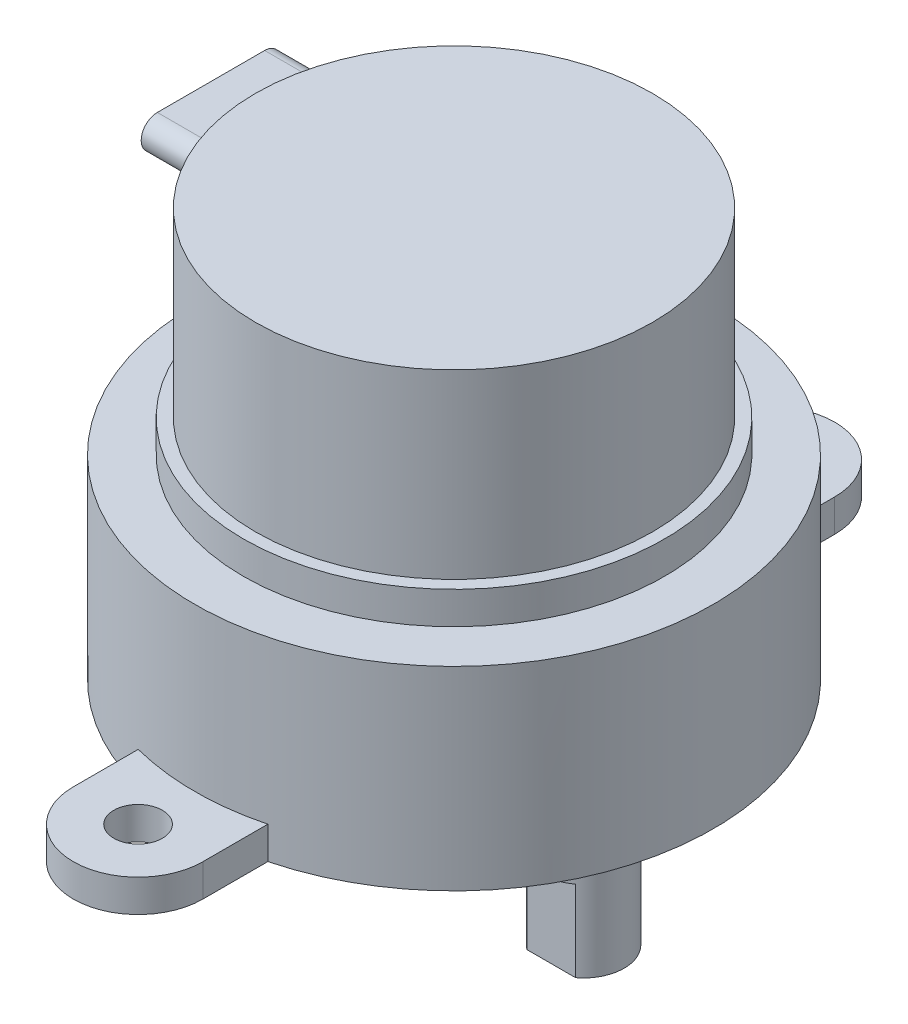
ISO-10303-21;
HEADER;
FILE_DESCRIPTION(('STEP AP214'),'2;1');
FILE_NAME('part.step','',(''),(''),'','','');
FILE_SCHEMA(('AUTOMOTIVE_DESIGN { 1 0 10303 214 1 1 1 1 }'));
ENDSEC;
DATA;
#1=APPLICATION_CONTEXT('core data for automotive mechanical design processes');
#2=APPLICATION_PROTOCOL_DEFINITION('international standard','automotive_design',2000,#1);
#3=PRODUCT_CONTEXT('',#1,'mechanical');
#4=PRODUCT('Part','Part','',(#3));
#5=PRODUCT_RELATED_PRODUCT_CATEGORY('part','',(#4));
#6=PRODUCT_DEFINITION_FORMATION('','',#4);
#7=PRODUCT_DEFINITION_CONTEXT('part definition',#1,'design');
#8=PRODUCT_DEFINITION('design','',#6,#7);
#9=PRODUCT_DEFINITION_SHAPE('','',#8);
#10=(LENGTH_UNIT() NAMED_UNIT(*) SI_UNIT(.MILLI.,.METRE.));
#11=(NAMED_UNIT(*) PLANE_ANGLE_UNIT() SI_UNIT($,.RADIAN.));
#12=(NAMED_UNIT(*) SI_UNIT($,.STERADIAN.) SOLID_ANGLE_UNIT());
#13=UNCERTAINTY_MEASURE_WITH_UNIT(LENGTH_MEASURE(1.E-05),#10,'distance_accuracy_value','');
#14=(GEOMETRIC_REPRESENTATION_CONTEXT(3) GLOBAL_UNCERTAINTY_ASSIGNED_CONTEXT((#13)) GLOBAL_UNIT_ASSIGNED_CONTEXT((#10,
#11,#12)) REPRESENTATION_CONTEXT('',''));
#15=CARTESIAN_POINT('',(0.,0.,0.));
#16=DIRECTION('',(0.,0.,1.));
#17=DIRECTION('',(1.,0.,0.));
#18=AXIS2_PLACEMENT_3D('',#15,#16,#17);
#19=CARTESIAN_POINT('',(0.,0.,0.));
#20=DIRECTION('',(0.,1.,0.));
#21=DIRECTION('',(0.,0.,1.));
#22=AXIS2_PLACEMENT_3D('',#19,#20,#21);
#23=PLANE('',#22);
#24=CARTESIAN_POINT('',(8.,0.,0.));
#25=DIRECTION('',(0.,1.,0.));
#26=DIRECTION('',(-1.,0.,0.));
#27=AXIS2_PLACEMENT_3D('',#24,#25,#26);
#28=CIRCLE('',#27,4.5);
#29=CARTESIAN_POINT('',(3.5,0.,0.));
#30=VERTEX_POINT('',#29);
#31=EDGE_CURVE('E226',#30,#30,#28,.T.);
#32=ORIENTED_EDGE('',*,*,#31,.T.);
#33=EDGE_LOOP('',(#32));
#34=FACE_BOUND('',#33,.T.);
#35=CARTESIAN_POINT('',(0.,0.,0.));
#36=DIRECTION('',(0.,-1.,0.));
#37=DIRECTION('',(0.,0.,-1.));
#38=AXIS2_PLACEMENT_3D('',#35,#36,#37);
#39=CIRCLE('',#38,16.);
#40=CARTESIAN_POINT('',(4.,0.,-15.4919333848297));
#41=VERTEX_POINT('',#40);
#42=CARTESIAN_POINT('',(3.99999999999999,0.,15.4919333848297));
#43=VERTEX_POINT('',#42);
#44=EDGE_CURVE('E356',#41,#43,#39,.T.);
#45=ORIENTED_EDGE('',*,*,#44,.T.);
#46=DIRECTION('',(0.,0.,1.));
#47=VECTOR('',#46,1.);
#48=CARTESIAN_POINT('',(4.,0.,-19.5));
#49=LINE('',#48,#47);
#50=CARTESIAN_POINT('',(3.99999999999999,0.,19.5));
#51=VERTEX_POINT('',#50);
#52=EDGE_CURVE('E312',#43,#51,#49,.T.);
#53=ORIENTED_EDGE('',*,*,#52,.T.);
#54=CARTESIAN_POINT('',(0.,0.,19.5));
#55=DIRECTION('',(0.,-1.,0.));
#56=DIRECTION('',(0.,0.,-1.));
#57=AXIS2_PLACEMENT_3D('',#54,#55,#56);
#58=CIRCLE('',#57,4.);
#59=CARTESIAN_POINT('',(-4.00000000000001,0.,19.5));
#60=VERTEX_POINT('',#59);
#61=EDGE_CURVE('E316',#51,#60,#58,.T.);
#62=ORIENTED_EDGE('',*,*,#61,.T.);
#63=DIRECTION('',(0.,0.,-1.));
#64=VECTOR('',#63,1.);
#65=CARTESIAN_POINT('',(-4.,0.,-19.5));
#66=LINE('',#65,#64);
#67=CARTESIAN_POINT('',(-4.,0.,15.4919333848297));
#68=VERTEX_POINT('',#67);
#69=EDGE_CURVE('E73',#60,#68,#66,.T.);
#70=ORIENTED_EDGE('',*,*,#69,.T.);
#71=CARTESIAN_POINT('',(-4.,0.,-15.4919333848297));
#72=VERTEX_POINT('',#71);
#73=EDGE_CURVE('E355',#68,#72,#39,.T.);
#74=ORIENTED_EDGE('',*,*,#73,.T.);
#75=CARTESIAN_POINT('',(-4.,0.,-19.5));
#76=VERTEX_POINT('',#75);
#77=EDGE_CURVE('E319',#72,#76,#66,.T.);
#78=ORIENTED_EDGE('',*,*,#77,.T.);
#79=CARTESIAN_POINT('',(0.,0.,-19.5));
#80=DIRECTION('',(0.,-1.,0.));
#81=DIRECTION('',(0.,0.,-1.));
#82=AXIS2_PLACEMENT_3D('',#79,#80,#81);
#83=CIRCLE('',#82,4.);
#84=CARTESIAN_POINT('',(4.,0.,-19.5));
#85=VERTEX_POINT('',#84);
#86=EDGE_CURVE('E286',#76,#85,#83,.T.);
#87=ORIENTED_EDGE('',*,*,#86,.T.);
#88=EDGE_CURVE('E313',#85,#41,#49,.T.);
#89=ORIENTED_EDGE('',*,*,#88,.T.);
#90=EDGE_LOOP('',(#45,#53,#62,#70,#74,#78,#87,#89));
#91=FACE_BOUND('',#90,.T.);
#92=CARTESIAN_POINT('',(0.,0.,-19.5));
#93=DIRECTION('',(0.,-1.,0.));
#94=DIRECTION('',(0.,0.,-1.));
#95=AXIS2_PLACEMENT_3D('',#92,#93,#94);
#96=CIRCLE('',#95,1.5);
#97=CARTESIAN_POINT('',(0.,0.,-21.));
#98=VERTEX_POINT('',#97);
#99=EDGE_CURVE('E273',#98,#98,#96,.T.);
#100=ORIENTED_EDGE('',*,*,#99,.F.);
#101=EDGE_LOOP('',(#100));
#102=FACE_BOUND('',#101,.T.);
#103=CARTESIAN_POINT('',(0.,0.,19.5));
#104=DIRECTION('',(0.,-1.,0.));
#105=DIRECTION('',(0.,0.,-1.));
#106=AXIS2_PLACEMENT_3D('',#103,#104,#105);
#107=CIRCLE('',#106,1.5);
#108=CARTESIAN_POINT('',(0.,0.,18.));
#109=VERTEX_POINT('',#108);
#110=EDGE_CURVE('E278',#109,#109,#107,.T.);
#111=ORIENTED_EDGE('',*,*,#110,.F.);
#112=EDGE_LOOP('',(#111));
#113=FACE_BOUND('',#112,.T.);
#114=ADVANCED_FACE('F45',(#34,#91,#102,#113),#23,.F.);
#115=CARTESIAN_POINT('',(0.,0.,0.));
#116=DIRECTION('',(0.,-1.,0.));
#117=DIRECTION('',(0.,0.,-1.));
#118=AXIS2_PLACEMENT_3D('',#115,#116,#117);
#119=CYLINDRICAL_SURFACE('',#118,16.);
#120=ORIENTED_EDGE('',*,*,#73,.F.);
#121=DIRECTION('',(0.,-1.,0.));
#122=VECTOR('',#121,1.);
#123=CARTESIAN_POINT('',(-4.,0.,15.4919333848297));
#124=LINE('',#123,#122);
#125=CARTESIAN_POINT('',(-4.,2.,15.4919333848297));
#126=VERTEX_POINT('',#125);
#127=EDGE_CURVE('E376',#68,#126,#124,.F.);
#128=ORIENTED_EDGE('',*,*,#127,.T.);
#129=CARTESIAN_POINT('',(0.,2.,0.));
#130=DIRECTION('',(0.,-1.,0.));
#131=DIRECTION('',(0.,0.,-1.));
#132=AXIS2_PLACEMENT_3D('',#129,#130,#131);
#133=CIRCLE('',#132,16.);
#134=CARTESIAN_POINT('',(3.99999999999999,2.,15.4919333848297));
#135=VERTEX_POINT('',#134);
#136=EDGE_CURVE('E364',#135,#126,#133,.T.);
#137=ORIENTED_EDGE('',*,*,#136,.F.);
#138=DIRECTION('',(0.,-1.,0.));
#139=VECTOR('',#138,1.);
#140=CARTESIAN_POINT('',(3.99999999999999,0.,15.4919333848297));
#141=LINE('',#140,#139);
#142=EDGE_CURVE('E372',#135,#43,#141,.T.);
#143=ORIENTED_EDGE('',*,*,#142,.T.);
#144=ORIENTED_EDGE('',*,*,#44,.F.);
#145=DIRECTION('',(0.,-1.,0.));
#146=VECTOR('',#145,1.);
#147=CARTESIAN_POINT('',(4.,0.,-15.4919333848297));
#148=LINE('',#147,#146);
#149=CARTESIAN_POINT('',(4.,2.,-15.4919333848297));
#150=VERTEX_POINT('',#149);
#151=EDGE_CURVE('E363',#41,#150,#148,.F.);
#152=ORIENTED_EDGE('',*,*,#151,.T.);
#153=CARTESIAN_POINT('',(-4.,2.,-15.4919333848297));
#154=VERTEX_POINT('',#153);
#155=EDGE_CURVE('E360',#154,#150,#133,.T.);
#156=ORIENTED_EDGE('',*,*,#155,.F.);
#157=DIRECTION('',(0.,-1.,0.));
#158=VECTOR('',#157,1.);
#159=CARTESIAN_POINT('',(-4.,0.,-15.4919333848297));
#160=LINE('',#159,#158);
#161=EDGE_CURVE('E368',#154,#72,#160,.T.);
#162=ORIENTED_EDGE('',*,*,#161,.T.);
#163=EDGE_LOOP('',(#120,#128,#137,#143,#144,#152,#156,#162));
#164=FACE_BOUND('',#163,.T.);
#165=CARTESIAN_POINT('',(0.,12.,0.));
#166=DIRECTION('',(0.,-1.,0.));
#167=DIRECTION('',(0.,0.,-1.));
#168=AXIS2_PLACEMENT_3D('',#165,#166,#167);
#169=CIRCLE('',#168,16.);
#170=CARTESIAN_POINT('',(0.,12.,-16.));
#171=VERTEX_POINT('',#170);
#172=EDGE_CURVE('E351',#171,#171,#169,.T.);
#173=ORIENTED_EDGE('',*,*,#172,.T.);
#174=EDGE_LOOP('',(#173));
#175=FACE_BOUND('',#174,.T.);
#176=ADVANCED_FACE('F493',(#164,#175),#119,.T.);
#177=CARTESIAN_POINT('',(-16.,12.,0.));
#178=DIRECTION('',(0.,-1.,0.));
#179=DIRECTION('',(0.,0.,-1.));
#180=AXIS2_PLACEMENT_3D('',#177,#178,#179);
#181=PLANE('',#180);
#182=ORIENTED_EDGE('',*,*,#172,.F.);
#183=EDGE_LOOP('',(#182));
#184=FACE_BOUND('',#183,.T.);
#185=CARTESIAN_POINT('',(0.,12.,0.));
#186=DIRECTION('',(0.,-1.,0.));
#187=DIRECTION('',(0.,0.,-1.));
#188=AXIS2_PLACEMENT_3D('',#185,#186,#187);
#189=CIRCLE('',#188,13.);
#190=CARTESIAN_POINT('',(0.,12.,-13.));
#191=VERTEX_POINT('',#190);
#192=EDGE_CURVE('E347',#191,#191,#189,.T.);
#193=ORIENTED_EDGE('',*,*,#192,.T.);
#194=EDGE_LOOP('',(#193));
#195=FACE_BOUND('',#194,.T.);
#196=ADVANCED_FACE('F498',(#184,#195),#181,.F.);
#197=CARTESIAN_POINT('',(0.,0.,0.));
#198=DIRECTION('',(0.,-1.,0.));
#199=DIRECTION('',(0.,0.,-1.));
#200=AXIS2_PLACEMENT_3D('',#197,#198,#199);
#201=CYLINDRICAL_SURFACE('',#200,13.);
#202=ORIENTED_EDGE('',*,*,#192,.F.);
#203=EDGE_LOOP('',(#202));
#204=FACE_BOUND('',#203,.T.);
#205=CARTESIAN_POINT('',(0.,14.,0.));
#206=DIRECTION('',(0.,-1.,0.));
#207=DIRECTION('',(0.,0.,-1.));
#208=AXIS2_PLACEMENT_3D('',#205,#206,#207);
#209=CIRCLE('',#208,13.);
#210=CARTESIAN_POINT('',(0.,14.,-13.));
#211=VERTEX_POINT('',#210);
#212=EDGE_CURVE('E343',#211,#211,#209,.T.);
#213=ORIENTED_EDGE('',*,*,#212,.T.);
#214=EDGE_LOOP('',(#213));
#215=FACE_BOUND('',#214,.T.);
#216=ADVANCED_FACE('F737',(#204,#215),#201,.T.);
#217=CARTESIAN_POINT('',(-13.,14.,0.));
#218=DIRECTION('',(0.,-1.,0.));
#219=DIRECTION('',(0.,0.,-1.));
#220=AXIS2_PLACEMENT_3D('',#217,#218,#219);
#221=PLANE('',#220);
#222=ORIENTED_EDGE('',*,*,#212,.F.);
#223=EDGE_LOOP('',(#222));
#224=FACE_BOUND('',#223,.T.);
#225=CARTESIAN_POINT('',(0.,14.,0.));
#226=DIRECTION('',(0.,-1.,0.));
#227=DIRECTION('',(0.,0.,-1.));
#228=AXIS2_PLACEMENT_3D('',#225,#226,#227);
#229=CIRCLE('',#228,12.25);
#230=CARTESIAN_POINT('',(0.,14.,-12.25));
#231=VERTEX_POINT('',#230);
#232=EDGE_CURVE('E339',#231,#231,#229,.T.);
#233=ORIENTED_EDGE('',*,*,#232,.T.);
#234=EDGE_LOOP('',(#233));
#235=FACE_BOUND('',#234,.T.);
#236=ADVANCED_FACE('F489',(#224,#235),#221,.F.);
#237=CARTESIAN_POINT('',(0.,0.,0.));
#238=DIRECTION('',(0.,-1.,0.));
#239=DIRECTION('',(0.,0.,-1.));
#240=AXIS2_PLACEMENT_3D('',#237,#238,#239);
#241=CYLINDRICAL_SURFACE('',#240,12.25);
#242=CARTESIAN_POINT('',(0.,24.4572690396545,0.));
#243=DIRECTION('',(0.,1.,0.));
#244=DIRECTION('',(0.,0.,1.));
#245=AXIS2_PLACEMENT_3D('',#242,#243,#244);
#246=CIRCLE('',#245,12.25);
#247=CARTESIAN_POINT('',(-11.7938401604838,24.4572690396545,-3.31177207382386));
#248=VERTEX_POINT('',#247);
#249=CARTESIAN_POINT('',(-11.7938401604838,24.4572690396545,3.31177207382386));
#250=VERTEX_POINT('',#249);
#251=EDGE_CURVE('E58',#248,#250,#246,.T.);
#252=ORIENTED_EDGE('',*,*,#251,.T.);
#253=CARTESIAN_POINT('',(-12.0291229978143,23.4612473633165,2.31575039748586));
#254=CARTESIAN_POINT('',(-12.0291228553257,23.5163558039375,2.31575289313123));
#255=CARTESIAN_POINT('',(-12.0282421603531,23.5715027834577,2.32034049925517));
#256=CARTESIAN_POINT('',(-12.0247123860103,23.6802670280192,2.33856254909503));
#257=CARTESIAN_POINT('',(-12.0220612662266,23.7338824535128,2.35220743120757));
#258=CARTESIAN_POINT('',(-12.014981252209,23.8379850213816,2.38810763952254));
#259=CARTESIAN_POINT('',(-12.0105536134619,23.8884743439844,2.41035688451991));
#260=CARTESIAN_POINT('',(-11.9999171649735,23.9849410072298,2.46276254765663));
#261=CARTESIAN_POINT('',(-11.9937087670059,24.0309193876651,2.49291713766545));
#262=CARTESIAN_POINT('',(-11.979486149344,24.1173797353794,2.56039123389823));
#263=CARTESIAN_POINT('',(-11.9714619965741,24.157829428338,2.59774997765174));
#264=CARTESIAN_POINT('',(-11.9536813163949,24.2318749256797,2.67837714902325));
#265=CARTESIAN_POINT('',(-11.9439246245273,24.2654700787565,2.7216461375708));
#266=CARTESIAN_POINT('',(-11.9226050196896,24.3254994991227,2.81358314820831));
#267=CARTESIAN_POINT('',(-11.9110142443529,24.3518024558372,2.86233038597002));
#268=CARTESIAN_POINT('',(-11.8863279108954,24.3958963531899,2.96317442875599));
#269=CARTESIAN_POINT('',(-11.8732321641352,24.413686225317,3.01527165332002));
#270=CARTESIAN_POINT('',(-11.8454086442429,24.4407939505958,3.12281276152129));
#271=CARTESIAN_POINT('',(-11.8306461091522,24.4498675907583,3.17830916370482));
#272=CARTESIAN_POINT('',(-11.8001379643754,24.458594724281,3.28976969102008));
#273=CARTESIAN_POINT('',(-11.7843921853909,24.4582465908806,3.3457338952548));
#274=CARTESIAN_POINT('',(-11.7518369919498,24.448091743878,3.45837656968306));
#275=CARTESIAN_POINT('',(-11.7350097444568,24.4379929957011,3.51502364734338));
#276=CARTESIAN_POINT('',(-11.7012793111345,24.4082302941593,3.62572948547661));
#277=CARTESIAN_POINT('',(-11.6843761135055,24.3885647997281,3.6797878273995));
#278=CARTESIAN_POINT('',(-11.6508013500551,24.3397395274086,3.78476130023629));
#279=CARTESIAN_POINT('',(-11.6341388613286,24.3104212664011,3.83560580751444));
#280=CARTESIAN_POINT('',(-11.6020427934053,24.2430913495916,3.93162420764904));
#281=CARTESIAN_POINT('',(-11.5866091966694,24.2050798178918,3.97679818144184));
#282=CARTESIAN_POINT('',(-11.5579491173835,24.1219905298166,4.05933402552607));
#283=CARTESIAN_POINT('',(-11.5446900688513,24.0770414368607,4.09681380204468));
#284=CARTESIAN_POINT('',(-11.5207842854396,23.9807955852705,4.16356711000504));
#285=CARTESIAN_POINT('',(-11.5101366360511,23.9295010582938,4.19284351477101));
#286=CARTESIAN_POINT('',(-11.4925767489849,23.8248809341406,4.24073095976884));
#287=CARTESIAN_POINT('',(-11.4854980848176,23.7718024006098,4.25982026684391));
#288=CARTESIAN_POINT('',(-11.4747090452421,23.6628672376864,4.28879883558905));
#289=CARTESIAN_POINT('',(-11.4709973032477,23.6070117451412,4.29869182995334));
#290=CARTESIAN_POINT('',(-11.4672904833259,23.4974475651448,4.30856985059715));
#291=CARTESIAN_POINT('',(-11.4671006457497,23.4437916782172,4.30907407730417));
#292=CARTESIAN_POINT('',(-11.4699513629619,23.3371847894246,4.30148021162517));
#293=CARTESIAN_POINT('',(-11.4729915093543,23.2842336993029,4.29338320677032));
#294=CARTESIAN_POINT('',(-11.482042441929,23.1814400856954,4.26911738851811));
#295=CARTESIAN_POINT('',(-11.4880023774942,23.1315602461202,4.25308669983221));
#296=CARTESIAN_POINT('',(-11.5025438942778,23.0352476487474,4.2135999088054));
#297=CARTESIAN_POINT('',(-11.5111257963249,22.9888153136578,4.19014289775285));
#298=CARTESIAN_POINT('',(-11.5308024301263,22.8990576749717,4.13569305169541));
#299=CARTESIAN_POINT('',(-11.541969482943,22.8558815143383,4.10448094364599));
#300=CARTESIAN_POINT('',(-11.5661279313887,22.7753204899075,4.03590196440492));
#301=CARTESIAN_POINT('',(-11.579119799787,22.7379371321931,3.99853349780141));
#302=CARTESIAN_POINT('',(-11.6071789919347,22.6677648824661,3.91636092482332));
#303=CARTESIAN_POINT('',(-11.6223225375842,22.6353613046505,3.87125369283733));
#304=CARTESIAN_POINT('',(-11.6534519627556,22.5785647900935,3.77651208608961));
#305=CARTESIAN_POINT('',(-11.6694380564882,22.5541739020241,3.72687655767842));
#306=CARTESIAN_POINT('',(-11.7024370069865,22.5130074339243,3.62196428713271));
#307=CARTESIAN_POINT('',(-11.7194631869705,22.4966355638738,3.56653288403953));
#308=CARTESIAN_POINT('',(-11.7532411802952,22.4736909713197,3.45359173643233));
#309=CARTESIAN_POINT('',(-11.7699929643278,22.4671192889098,3.39608177198397));
#310=CARTESIAN_POINT('',(-11.802902751075,22.4640219834538,3.27988917122721));
#311=CARTESIAN_POINT('',(-11.8190515792993,22.4676141162533,3.2212006758717));
#312=CARTESIAN_POINT('',(-11.8500971415596,22.4851468673847,3.10504614431646));
#313=CARTESIAN_POINT('',(-11.8649939933023,22.499086511662,3.04757999357603));
#314=CARTESIAN_POINT('',(-11.8928924844919,22.5366887695551,2.93680229195475));
#315=CARTESIAN_POINT('',(-11.9059264171865,22.5601485870371,2.88343014143513));
#316=CARTESIAN_POINT('',(-11.9301996840858,22.6162362600189,2.78129337219548));
#317=CARTESIAN_POINT('',(-11.9414394057494,22.6488621319021,2.73252775962696));
#318=CARTESIAN_POINT('',(-11.9616347229007,22.7212342294054,2.64269773086271));
#319=CARTESIAN_POINT('',(-11.9706517723668,22.7607199508371,2.60143718884967));
#320=CARTESIAN_POINT('',(-11.9867748134512,22.8463959637725,2.52610719291297));
#321=CARTESIAN_POINT('',(-11.993880621718,22.8925868978745,2.4920384289869));
#322=CARTESIAN_POINT('',(-12.005992981891,22.9890720732903,2.4330064881146));
#323=CARTESIAN_POINT('',(-12.0110481639672,23.0392326851642,2.40783446116526));
#324=CARTESIAN_POINT('',(-12.019309108042,23.143158134678,2.36625491774498));
#325=CARTESIAN_POINT('',(-12.0225172220688,23.1969182908446,2.34983625685307));
#326=CARTESIAN_POINT('',(-12.0262484315747,23.2860666445652,2.33064399334522));
#327=CARTESIAN_POINT('',(-12.027326342603,23.3208539835066,2.32506679527641));
#328=CARTESIAN_POINT('',(-12.028763668412,23.3908380933449,2.31761921464727));
#329=CARTESIAN_POINT('',(-12.0291230888598,23.4260348610102,2.31574880284959));
#330=CARTESIAN_POINT('',(-12.0291229978143,23.4612473633165,2.31575039748586));
#331=B_SPLINE_CURVE_WITH_KNOTS('',3,(#253,#254,#255,#256,#257,#258,#259,#260,#261,#262,#263,
#264,#265,#266,#267,#268,#269,#270,#271,#272,#273,#274,#275,#276,#277,#278,#279,#280,#281,#282,
#283,#284,#285,#286,#287,#288,#289,#290,#291,#292,#293,#294,#295,#296,#297,#298,#299,#300,#301,
#302,#303,#304,#305,#306,#307,#308,#309,#310,#311,#312,#313,#314,#315,#316,#317,#318,#319,#320,
#321,#322,#323,#324,#325,#326,#327,#328,#329,#330),.UNSPECIFIED.,.T.,.F.,(4,2,2,2,2,2,2,2,2,2,2,
2,2,2,2,2,2,2,2,2,2,2,2,2,2,2,2,2,2,2,2,2,2,2,2,2,2,2,4),(0.,0.16519613219826,0.330582982185192,
0.495853156631094,0.661085145603034,0.827243877341872,0.993418389846258,1.16241519743595,
1.33143321092765,1.50505947822985,1.67871572398328,1.85773972987867,2.0367925835432,
2.21894544273645,2.40109570174005,2.5802028183471,2.7592471220067,2.92891450638551,
3.09851299430883,3.25870298018482,3.41887271420894,3.57634712356885,3.73384080951896,
3.89643039575452,4.0590621833284,4.23100014590652,4.40298203516394,4.58290638324749,
4.76284982533794,4.94488656206978,5.12690616509212,5.30523651165676,5.483528295621,
5.65612938477878,5.82874702620753,5.99699075851276,6.1650197752654,6.27057556676477,
6.37613052568712),.UNSPECIFIED.);
#332=CARTESIAN_POINT('',(-11.7938401604838,22.4652256869785,3.31177207382386));
#333=VERTEX_POINT('',#332);
#334=EDGE_CURVE('E11',#250,#333,#331,.T.);
#335=ORIENTED_EDGE('',*,*,#334,.T.);
#336=CARTESIAN_POINT('',(0.,22.4652256869785,0.));
#337=DIRECTION('',(0.,-1.,0.));
#338=DIRECTION('',(0.,0.,-1.));
#339=AXIS2_PLACEMENT_3D('',#336,#337,#338);
#340=CIRCLE('',#339,12.25);
#341=CARTESIAN_POINT('',(-11.7938401604838,22.4652256869785,-3.31177207382386));
#342=VERTEX_POINT('',#341);
#343=EDGE_CURVE('E171',#333,#342,#340,.T.);
#344=ORIENTED_EDGE('',*,*,#343,.T.);
#345=CARTESIAN_POINT('',(-11.4675809570313,23.4612473633165,-4.30779375016186));
#346=CARTESIAN_POINT('',(-11.4675823385033,23.514735393131,-4.30779099344668));
#347=CARTESIAN_POINT('',(-11.4692095829825,23.5682623204881,-4.30346594018228));
#348=CARTESIAN_POINT('',(-11.4756264183926,23.673782082337,-4.28632456457978));
#349=CARTESIAN_POINT('',(-11.4804197990567,23.7257730002805,-4.27349806630176));
#350=CARTESIAN_POINT('',(-11.4928785863639,23.8266220647616,-4.23987736918563));
#351=CARTESIAN_POINT('',(-11.5005382010916,23.8754862978961,-4.21909923662842));
#352=CARTESIAN_POINT('',(-11.5183204688691,23.9689444384245,-4.17030750836902));
#353=CARTESIAN_POINT('',(-11.5284429165426,24.0135387014604,-4.14229451597171));
#354=CARTESIAN_POINT('',(-11.5510118962276,24.0987506666497,-4.07894422169009));
#355=CARTESIAN_POINT('',(-11.5635202930667,24.1392040388,-4.04340828197144));
#356=CARTESIAN_POINT('',(-11.5900882844105,24.2136484257979,-3.96661105890875));
#357=CARTESIAN_POINT('',(-11.6041483029992,24.2476376669436,-3.925348209507));
#358=CARTESIAN_POINT('',(-11.6341173315314,24.3102333236541,-3.83564508294493));
#359=CARTESIAN_POINT('',(-11.6500862627698,24.3384141428333,-3.78692756659087));
#360=CARTESIAN_POINT('',(-11.6825398072531,24.3861560799835,-3.68559280317175));
#361=CARTESIAN_POINT('',(-11.6990245400917,24.405715182825,-3.63297464777481));
#362=CARTESIAN_POINT('',(-11.7325675982206,24.4363032212209,-3.52317613039095));
#363=CARTESIAN_POINT('',(-11.7496244167997,24.4469872772178,-3.46589883774411));
#364=CARTESIAN_POINT('',(-11.7831408326881,24.4582243463041,-3.35018212660029));
#365=CARTESIAN_POINT('',(-11.7996004079001,24.4587769849223,-3.29174266522786));
#366=CARTESIAN_POINT('',(-11.8314587324005,24.449606398936,-3.17533116369798));
#367=CARTESIAN_POINT('',(-11.84685675928,24.4398762487649,-3.11735946509733));
#368=CARTESIAN_POINT('',(-11.8761869827589,24.4102417894884,-3.00368583889532));
#369=CARTESIAN_POINT('',(-11.8901193763927,24.3903388500893,-2.9479836068135));
#370=CARTESIAN_POINT('',(-11.9158790092058,24.3414354491907,-2.84204598768388));
#371=CARTESIAN_POINT('',(-11.9277517038988,24.3126860048453,-2.79170585742785));
#372=CARTESIAN_POINT('',(-11.949632335806,24.2466563452146,-2.69651165120903));
#373=CARTESIAN_POINT('',(-11.9596406051303,24.2093776518858,-2.65165659867932));
#374=CARTESIAN_POINT('',(-11.9773967935066,24.1286149778025,-2.5702436297962));
#375=CARTESIAN_POINT('',(-11.9852056846173,24.0853618909762,-2.53346986273346));
#376=CARTESIAN_POINT('',(-11.9989219203498,23.9930365652074,-2.46769230545546));
#377=CARTESIAN_POINT('',(-12.0048295134508,23.9439650878142,-2.43868750000334));
#378=CARTESIAN_POINT('',(-12.0146228931243,23.8425957300749,-2.38996720561662));
#379=CARTESIAN_POINT('',(-12.0185511643041,23.7903952388195,-2.37005746040349));
#380=CARTESIAN_POINT('',(-12.0245910267929,23.6833051198596,-2.33922205814041));
#381=CARTESIAN_POINT('',(-12.0267027499351,23.6284156876065,-2.32829574913396));
#382=CARTESIAN_POINT('',(-12.0291054400941,23.5181776608368,-2.31585027769195));
#383=CARTESIAN_POINT('',(-12.0294168824626,23.4628414276114,-2.31422532904822));
#384=CARTESIAN_POINT('',(-12.0282756116245,23.3526817261416,-2.32014969518336));
#385=CARTESIAN_POINT('',(-12.0268229526254,23.2978582421935,-2.32769872806355));
#386=CARTESIAN_POINT('',(-12.0221529317679,23.1904364076154,-2.35169855398662));
#387=CARTESIAN_POINT('',(-12.0189404963002,23.1378322847511,-2.36812449492607));
#388=CARTESIAN_POINT('',(-12.010744672023,23.0361631063415,-2.4093466683474));
#389=CARTESIAN_POINT('',(-12.0057612816738,22.9870980538734,-2.43414290810688));
#390=CARTESIAN_POINT('',(-11.9939963491293,22.8936403022891,-2.49146706923415));
#391=CARTESIAN_POINT('',(-11.9872066244494,22.8492701822754,-2.52403010202333));
#392=CARTESIAN_POINT('',(-11.9718658137999,22.7666504382971,-2.59581832362416));
#393=CARTESIAN_POINT('',(-11.9633146508401,22.728401081993,-2.63504380362966));
#394=CARTESIAN_POINT('',(-11.9443922091913,22.6585242409963,-2.71953861939047));
#395=CARTESIAN_POINT('',(-11.9339979907413,22.6269927693829,-2.76488216825394));
#396=CARTESIAN_POINT('',(-11.9115991849343,22.5719618101735,-2.85983963253004));
#397=CARTESIAN_POINT('',(-11.8995944320143,22.5484631492337,-2.90945398679372));
#398=CARTESIAN_POINT('',(-11.87386396104,22.5095259024658,-3.01276497878558));
#399=CARTESIAN_POINT('',(-11.8601038428095,22.4942943879969,-3.06653103090423));
#400=CARTESIAN_POINT('',(-11.8313833390476,22.4730241254257,-3.17553874700752));
#401=CARTESIAN_POINT('',(-11.8164227553828,22.4669868981122,-3.2307806535698));
#402=CARTESIAN_POINT('',(-11.7851788909282,22.4640857718574,-3.34298560264983));
#403=CARTESIAN_POINT('',(-11.7688689516277,22.4675128240022,-3.39994877404448));
#404=CARTESIAN_POINT('',(-11.7358160357641,22.4839767595815,-3.51234343943391));
#405=CARTESIAN_POINT('',(-11.7190729839281,22.497015324427,-3.56777466367368));
#406=CARTESIAN_POINT('',(-11.6852796808295,22.5327690261067,-3.67696675730414));
#407=CARTESIAN_POINT('',(-11.668231920419,22.5557128340529,-3.73065371093514));
#408=CARTESIAN_POINT('',(-11.6348851678132,22.6107351432057,-3.83338846061191));
#409=CARTESIAN_POINT('',(-11.618586204954,22.6428140019478,-3.88243607497911));
#410=CARTESIAN_POINT('',(-11.5874930528142,22.7152192297941,-3.97427350910224));
#411=CARTESIAN_POINT('',(-11.5726937709582,22.7555161840716,-4.01708473889054));
#412=CARTESIAN_POINT('',(-11.5452641666523,22.84344883966,-4.09525282774274));
#413=CARTESIAN_POINT('',(-11.5326338724324,22.891084636473,-4.13060958978566));
#414=CARTESIAN_POINT('',(-11.5107335226863,22.9902601891567,-4.19124240582583));
#415=CARTESIAN_POINT('',(-11.5013453292659,23.0415543894736,-4.21687727777042));
#416=CARTESIAN_POINT('',(-11.485800954343,23.1481611170847,-4.25903599311431));
#417=CARTESIAN_POINT('',(-11.4796391428014,23.203466451584,-4.27557571011682));
#418=CARTESIAN_POINT('',(-11.4727370937353,23.2929159217272,-4.29404844374202));
#419=CARTESIAN_POINT('',(-11.4708084072725,23.3263395845511,-4.29919387044317));
#420=CARTESIAN_POINT('',(-11.4682299239353,23.3935861059179,-4.30606733686667));
#421=CARTESIAN_POINT('',(-11.4675800830634,23.4274089506871,-4.30779549415704));
#422=CARTESIAN_POINT('',(-11.4675809570313,23.4612473633165,-4.30779375016186));
#423=B_SPLINE_CURVE_WITH_KNOTS('',3,(#345,#346,#347,#348,#349,#350,#351,#352,#353,#354,#355,
#356,#357,#358,#359,#360,#361,#362,#363,#364,#365,#366,#367,#368,#369,#370,#371,#372,#373,#374,
#375,#376,#377,#378,#379,#380,#381,#382,#383,#384,#385,#386,#387,#388,#389,#390,#391,#392,#393,
#394,#395,#396,#397,#398,#399,#400,#401,#402,#403,#404,#405,#406,#407,#408,#409,#410,#411,#412,
#413,#414,#415,#416,#417,#418,#419,#420,#421,#422),.UNSPECIFIED.,.T.,.F.,(4,2,2,2,2,2,2,2,2,2,2,
2,2,2,2,2,2,2,2,2,2,2,2,2,2,2,2,2,2,2,2,2,2,2,2,2,2,2,4),(0.,0.160335631717507,
0.320863527145081,0.481068773864914,0.641260665603355,0.8063756943345,0.97153596404701,
1.14625874597288,1.32102234373742,1.50229573412719,1.6835758246187,1.8649780870221,
2.04635593110691,2.22299956749898,2.39961170820781,2.57069285143226,2.74175162709696,
2.90896307273029,3.07616238222651,3.24145626369603,3.40674506613324,3.57157349953342,
3.736402076245,3.90199041035302,4.06758598365019,4.2354094559419,4.40325019374128,
4.57512083232464,4.74701989622891,4.92426180413779,5.10153472560851,5.28313948744046,
5.46475135805334,5.6457242523715,5.8266995019331,6.0001297597559,6.17325636448256,
6.27469382540995,6.37612779641367),.UNSPECIFIED.);
#424=EDGE_CURVE('E382',#342,#248,#423,.T.);
#425=ORIENTED_EDGE('',*,*,#424,.T.);
#426=EDGE_LOOP('',(#252,#335,#344,#425));
#427=FACE_BOUND('',#426,.T.);
#428=ORIENTED_EDGE('',*,*,#232,.F.);
#429=EDGE_LOOP('',(#428));
#430=FACE_BOUND('',#429,.T.);
#431=CARTESIAN_POINT('',(0.,25.2,0.));
#432=DIRECTION('',(0.,-1.,0.));
#433=DIRECTION('',(0.,0.,-1.));
#434=AXIS2_PLACEMENT_3D('',#431,#432,#433);
#435=CIRCLE('',#434,12.25);
#436=CARTESIAN_POINT('',(0.,25.2,-12.25));
#437=VERTEX_POINT('',#436);
#438=EDGE_CURVE('E326',#437,#437,#435,.T.);
#439=ORIENTED_EDGE('',*,*,#438,.T.);
#440=EDGE_LOOP('',(#439));
#441=FACE_BOUND('',#440,.T.);
#442=ADVANCED_FACE('F389',(#427,#430,#441),#241,.T.);
#443=CARTESIAN_POINT('',(-12.25,25.2,0.));
#444=DIRECTION('',(0.,-1.,0.));
#445=DIRECTION('',(0.,0.,-1.));
#446=AXIS2_PLACEMENT_3D('',#443,#444,#445);
#447=PLANE('',#446);
#448=ORIENTED_EDGE('',*,*,#438,.F.);
#449=EDGE_LOOP('',(#448));
#450=FACE_BOUND('',#449,.T.);
#451=ADVANCED_FACE('F458',(#450),#447,.F.);
#452=CARTESIAN_POINT('',(0.,2.,-19.5));
#453=DIRECTION('',(0.,-1.,0.));
#454=DIRECTION('',(0.,0.,-1.));
#455=AXIS2_PLACEMENT_3D('',#452,#453,#454);
#456=CYLINDRICAL_SURFACE('',#455,1.5);
#457=CARTESIAN_POINT('',(0.,2.,-19.5));
#458=DIRECTION('',(0.,-1.,0.));
#459=DIRECTION('',(0.,0.,-1.));
#460=AXIS2_PLACEMENT_3D('',#457,#458,#459);
#461=CIRCLE('',#460,1.5);
#462=CARTESIAN_POINT('',(0.,2.,-21.));
#463=VERTEX_POINT('',#462);
#464=EDGE_CURVE('E274',#463,#463,#461,.T.);
#465=ORIENTED_EDGE('',*,*,#464,.F.);
#466=EDGE_LOOP('',(#465));
#467=FACE_BOUND('',#466,.T.);
#468=ORIENTED_EDGE('',*,*,#99,.T.);
#469=EDGE_LOOP('',(#468));
#470=FACE_BOUND('',#469,.T.);
#471=ADVANCED_FACE('F454',(#467,#470),#456,.F.);
#472=CARTESIAN_POINT('',(0.,2.,-19.5));
#473=DIRECTION('',(0.,-1.,0.));
#474=DIRECTION('',(0.,0.,-1.));
#475=AXIS2_PLACEMENT_3D('',#472,#473,#474);
#476=CYLINDRICAL_SURFACE('',#475,4.);
#477=ORIENTED_EDGE('',*,*,#86,.F.);
#478=DIRECTION('',(0.,-1.,0.));
#479=VECTOR('',#478,1.);
#480=CARTESIAN_POINT('',(-4.,2.,-19.5));
#481=LINE('',#480,#479);
#482=CARTESIAN_POINT('',(-4.,2.,-19.5));
#483=VERTEX_POINT('',#482);
#484=EDGE_CURVE('E322',#483,#76,#481,.T.);
#485=ORIENTED_EDGE('',*,*,#484,.F.);
#486=CARTESIAN_POINT('',(0.,2.,-19.5));
#487=DIRECTION('',(0.,-1.,0.));
#488=DIRECTION('',(0.,0.,-1.));
#489=AXIS2_PLACEMENT_3D('',#486,#487,#488);
#490=CIRCLE('',#489,4.);
#491=CARTESIAN_POINT('',(4.,2.,-19.5));
#492=VERTEX_POINT('',#491);
#493=EDGE_CURVE('E290',#483,#492,#490,.T.);
#494=ORIENTED_EDGE('',*,*,#493,.T.);
#495=DIRECTION('',(0.,-1.,0.));
#496=VECTOR('',#495,1.);
#497=CARTESIAN_POINT('',(4.,2.,-19.5));
#498=LINE('',#497,#496);
#499=EDGE_CURVE('E308',#492,#85,#498,.T.);
#500=ORIENTED_EDGE('',*,*,#499,.T.);
#501=EDGE_LOOP('',(#477,#485,#494,#500));
#502=FACE_BOUND('',#501,.T.);
#503=ADVANCED_FACE('F457',(#502),#476,.T.);
#504=CARTESIAN_POINT('',(0.,2.,-19.5));
#505=DIRECTION('',(0.,-1.,0.));
#506=DIRECTION('',(0.,0.,-1.));
#507=AXIS2_PLACEMENT_3D('',#504,#505,#506);
#508=PLANE('',#507);
#509=ORIENTED_EDGE('',*,*,#464,.T.);
#510=EDGE_LOOP('',(#509));
#511=FACE_BOUND('',#510,.T.);
#512=DIRECTION('',(0.,0.,-1.));
#513=VECTOR('',#512,1.);
#514=CARTESIAN_POINT('',(-4.,2.,-19.5));
#515=LINE('',#514,#513);
#516=EDGE_CURVE('E303',#154,#483,#515,.T.);
#517=ORIENTED_EDGE('',*,*,#516,.F.);
#518=ORIENTED_EDGE('',*,*,#155,.T.);
#519=DIRECTION('',(0.,0.,1.));
#520=VECTOR('',#519,1.);
#521=CARTESIAN_POINT('',(4.,2.,-19.5));
#522=LINE('',#521,#520);
#523=EDGE_CURVE('E295',#492,#150,#522,.T.);
#524=ORIENTED_EDGE('',*,*,#523,.F.);
#525=ORIENTED_EDGE('',*,*,#493,.F.);
#526=EDGE_LOOP('',(#517,#518,#524,#525));
#527=FACE_BOUND('',#526,.T.);
#528=ADVANCED_FACE('F464',(#511,#527),#508,.F.);
#529=CARTESIAN_POINT('',(4.,2.,-19.5));
#530=DIRECTION('',(1.,0.,0.));
#531=DIRECTION('',(0.,0.,-1.));
#532=AXIS2_PLACEMENT_3D('',#529,#530,#531);
#533=PLANE('',#532);
#534=ORIENTED_EDGE('',*,*,#151,.F.);
#535=ORIENTED_EDGE('',*,*,#88,.F.);
#536=ORIENTED_EDGE('',*,*,#499,.F.);
#537=ORIENTED_EDGE('',*,*,#523,.T.);
#538=EDGE_LOOP('',(#534,#535,#536,#537));
#539=FACE_BOUND('',#538,.T.);
#540=ADVANCED_FACE('F467',(#539),#533,.T.);
#541=CARTESIAN_POINT('',(-4.,2.,-19.5));
#542=DIRECTION('',(-1.,0.,0.));
#543=DIRECTION('',(0.,0.,1.));
#544=AXIS2_PLACEMENT_3D('',#541,#542,#543);
#545=PLANE('',#544);
#546=ORIENTED_EDGE('',*,*,#161,.F.);
#547=ORIENTED_EDGE('',*,*,#516,.T.);
#548=ORIENTED_EDGE('',*,*,#484,.T.);
#549=ORIENTED_EDGE('',*,*,#77,.F.);
#550=EDGE_LOOP('',(#546,#547,#548,#549));
#551=FACE_BOUND('',#550,.T.);
#552=ADVANCED_FACE('F470',(#551),#545,.T.);
#553=ORIENTED_EDGE('',*,*,#127,.F.);
#554=ORIENTED_EDGE('',*,*,#69,.F.);
#555=DIRECTION('',(0.,-1.,0.));
#556=VECTOR('',#555,1.);
#557=CARTESIAN_POINT('',(-4.00000000000001,2.,19.5));
#558=LINE('',#557,#556);
#559=CARTESIAN_POINT('',(-4.00000000000001,2.,19.5));
#560=VERTEX_POINT('',#559);
#561=EDGE_CURVE('E327',#560,#60,#558,.T.);
#562=ORIENTED_EDGE('',*,*,#561,.F.);
#563=EDGE_CURVE('E304',#560,#126,#515,.T.);
#564=ORIENTED_EDGE('',*,*,#563,.T.);
#565=EDGE_LOOP('',(#553,#554,#562,#564));
#566=FACE_BOUND('',#565,.T.);
#567=ADVANCED_FACE('F473',(#566),#545,.T.);
#568=ORIENTED_EDGE('',*,*,#142,.F.);
#569=CARTESIAN_POINT('',(3.99999999999999,2.,19.5));
#570=VERTEX_POINT('',#569);
#571=EDGE_CURVE('E294',#135,#570,#522,.T.);
#572=ORIENTED_EDGE('',*,*,#571,.T.);
#573=DIRECTION('',(0.,-1.,0.));
#574=VECTOR('',#573,1.);
#575=CARTESIAN_POINT('',(3.99999999999999,2.,19.5));
#576=LINE('',#575,#574);
#577=EDGE_CURVE('E330',#570,#51,#576,.T.);
#578=ORIENTED_EDGE('',*,*,#577,.T.);
#579=ORIENTED_EDGE('',*,*,#52,.F.);
#580=EDGE_LOOP('',(#568,#572,#578,#579));
#581=FACE_BOUND('',#580,.T.);
#582=ADVANCED_FACE('F478',(#581),#533,.T.);
#583=CARTESIAN_POINT('',(0.,2.,19.5));
#584=DIRECTION('',(0.,-1.,0.));
#585=DIRECTION('',(0.,0.,-1.));
#586=AXIS2_PLACEMENT_3D('',#583,#584,#585);
#587=CIRCLE('',#586,1.5);
#588=CARTESIAN_POINT('',(0.,2.,18.));
#589=VERTEX_POINT('',#588);
#590=EDGE_CURVE('E282',#589,#589,#587,.T.);
#591=ORIENTED_EDGE('',*,*,#590,.T.);
#592=EDGE_LOOP('',(#591));
#593=FACE_BOUND('',#592,.T.);
#594=ORIENTED_EDGE('',*,*,#571,.F.);
#595=ORIENTED_EDGE('',*,*,#136,.T.);
#596=ORIENTED_EDGE('',*,*,#563,.F.);
#597=CARTESIAN_POINT('',(0.,2.,19.5));
#598=DIRECTION('',(0.,-1.,0.));
#599=DIRECTION('',(0.,0.,-1.));
#600=AXIS2_PLACEMENT_3D('',#597,#598,#599);
#601=CIRCLE('',#600,4.);
#602=EDGE_CURVE('E299',#570,#560,#601,.T.);
#603=ORIENTED_EDGE('',*,*,#602,.F.);
#604=EDGE_LOOP('',(#594,#595,#596,#603));
#605=FACE_BOUND('',#604,.T.);
#606=ADVANCED_FACE('F469',(#593,#605),#508,.F.);
#607=CARTESIAN_POINT('',(0.,2.,19.5));
#608=DIRECTION('',(0.,-1.,0.));
#609=DIRECTION('',(0.,0.,-1.));
#610=AXIS2_PLACEMENT_3D('',#607,#608,#609);
#611=CYLINDRICAL_SURFACE('',#610,4.);
#612=ORIENTED_EDGE('',*,*,#61,.F.);
#613=ORIENTED_EDGE('',*,*,#577,.F.);
#614=ORIENTED_EDGE('',*,*,#602,.T.);
#615=ORIENTED_EDGE('',*,*,#561,.T.);
#616=EDGE_LOOP('',(#612,#613,#614,#615));
#617=FACE_BOUND('',#616,.T.);
#618=ADVANCED_FACE('F462',(#617),#611,.T.);
#619=CARTESIAN_POINT('',(0.,2.,19.5));
#620=DIRECTION('',(0.,-1.,0.));
#621=DIRECTION('',(0.,0.,-1.));
#622=AXIS2_PLACEMENT_3D('',#619,#620,#621);
#623=CYLINDRICAL_SURFACE('',#622,1.5);
#624=ORIENTED_EDGE('',*,*,#590,.F.);
#625=EDGE_LOOP('',(#624));
#626=FACE_BOUND('',#625,.T.);
#627=ORIENTED_EDGE('',*,*,#110,.T.);
#628=EDGE_LOOP('',(#627));
#629=FACE_BOUND('',#628,.T.);
#630=ADVANCED_FACE('F452',(#626,#629),#623,.F.);
#631=CARTESIAN_POINT('',(8.,-10.2,0.));
#632=DIRECTION('',(0.,-1.,0.));
#633=DIRECTION('',(1.,0.,0.));
#634=AXIS2_PLACEMENT_3D('',#631,#632,#633);
#635=PLANE('',#634);
#636=DIRECTION('',(1.,0.,0.));
#637=VECTOR('',#636,1.);
#638=CARTESIAN_POINT('',(5.32727360302391,-10.2,2.));
#639=LINE('',#638,#637);
#640=CARTESIAN_POINT('',(6.5,-10.2,2.));
#641=VERTEX_POINT('',#640);
#642=CARTESIAN_POINT('',(9.5,-10.2,2.));
#643=VERTEX_POINT('',#642);
#644=EDGE_CURVE('E211',#641,#643,#639,.T.);
#645=ORIENTED_EDGE('',*,*,#644,.F.);
#646=CARTESIAN_POINT('',(8.,-10.2,0.));
#647=DIRECTION('',(0.,1.,0.));
#648=DIRECTION('',(-1.,0.,0.));
#649=AXIS2_PLACEMENT_3D('',#646,#647,#648);
#650=CIRCLE('',#649,2.5);
#651=CARTESIAN_POINT('',(6.5,-10.2,-2.));
#652=VERTEX_POINT('',#651);
#653=EDGE_CURVE('E246',#652,#641,#650,.T.);
#654=ORIENTED_EDGE('',*,*,#653,.F.);
#655=DIRECTION('',(-1.,0.,0.));
#656=VECTOR('',#655,1.);
#657=CARTESIAN_POINT('',(3.62547666157584,-10.2,-2.));
#658=LINE('',#657,#656);
#659=CARTESIAN_POINT('',(9.5,-10.2,-2.));
#660=VERTEX_POINT('',#659);
#661=EDGE_CURVE('E200',#660,#652,#658,.T.);
#662=ORIENTED_EDGE('',*,*,#661,.F.);
#663=EDGE_CURVE('E250',#643,#660,#650,.T.);
#664=ORIENTED_EDGE('',*,*,#663,.F.);
#665=EDGE_LOOP('',(#645,#654,#662,#664));
#666=FACE_BOUND('',#665,.T.);
#667=CARTESIAN_POINT('',(8.,-10.2,0.));
#668=DIRECTION('',(0.,-1.,0.));
#669=DIRECTION('',(0.,0.,-1.));
#670=AXIS2_PLACEMENT_3D('',#667,#668,#669);
#671=CIRCLE('',#670,1.24999999999999);
#672=CARTESIAN_POINT('',(8.,-10.2,-1.24999999999999));
#673=VERTEX_POINT('',#672);
#674=EDGE_CURVE('E210',#673,#673,#671,.T.);
#675=ORIENTED_EDGE('',*,*,#674,.F.);
#676=EDGE_LOOP('',(#675));
#677=FACE_BOUND('',#676,.T.);
#678=ADVANCED_FACE('F448',(#666,#677),#635,.T.);
#679=CARTESIAN_POINT('',(8.,0.,0.));
#680=DIRECTION('',(0.,1.,0.));
#681=DIRECTION('',(-1.,0.,0.));
#682=AXIS2_PLACEMENT_3D('',#679,#680,#681);
#683=CYLINDRICAL_SURFACE('',#682,2.5);
#684=DIRECTION('',(0.,1.,0.));
#685=VECTOR('',#684,1.);
#686=CARTESIAN_POINT('',(6.5,0.,2.));
#687=LINE('',#686,#685);
#688=CARTESIAN_POINT('',(6.5,-5.2,2.));
#689=VERTEX_POINT('',#688);
#690=EDGE_CURVE('E270',#689,#641,#687,.F.);
#691=ORIENTED_EDGE('',*,*,#690,.F.);
#692=CARTESIAN_POINT('',(8.,-5.2,0.));
#693=DIRECTION('',(0.,-1.,0.));
#694=DIRECTION('',(1.,0.,0.));
#695=AXIS2_PLACEMENT_3D('',#692,#693,#694);
#696=CIRCLE('',#695,2.5);
#697=CARTESIAN_POINT('',(9.5,-5.2,2.));
#698=VERTEX_POINT('',#697);
#699=EDGE_CURVE('E262',#689,#698,#696,.F.);
#700=ORIENTED_EDGE('',*,*,#699,.T.);
#701=DIRECTION('',(0.,1.,0.));
#702=VECTOR('',#701,1.);
#703=CARTESIAN_POINT('',(9.5,0.,2.));
#704=LINE('',#703,#702);
#705=EDGE_CURVE('E266',#643,#698,#704,.T.);
#706=ORIENTED_EDGE('',*,*,#705,.F.);
#707=ORIENTED_EDGE('',*,*,#663,.T.);
#708=DIRECTION('',(0.,1.,0.));
#709=VECTOR('',#708,1.);
#710=CARTESIAN_POINT('',(9.5,0.,-2.));
#711=LINE('',#710,#709);
#712=CARTESIAN_POINT('',(9.5,-5.2,-2.));
#713=VERTEX_POINT('',#712);
#714=EDGE_CURVE('E259',#713,#660,#711,.F.);
#715=ORIENTED_EDGE('',*,*,#714,.F.);
#716=CARTESIAN_POINT('',(8.,-5.2,0.));
#717=DIRECTION('',(0.,-1.,0.));
#718=DIRECTION('',(1.,0.,0.));
#719=AXIS2_PLACEMENT_3D('',#716,#717,#718);
#720=CIRCLE('',#719,2.5);
#721=CARTESIAN_POINT('',(6.5,-5.2,-2.));
#722=VERTEX_POINT('',#721);
#723=EDGE_CURVE('E251',#713,#722,#720,.F.);
#724=ORIENTED_EDGE('',*,*,#723,.T.);
#725=DIRECTION('',(0.,1.,0.));
#726=VECTOR('',#725,1.);
#727=CARTESIAN_POINT('',(6.5,0.,-2.));
#728=LINE('',#727,#726);
#729=EDGE_CURVE('E255',#652,#722,#728,.T.);
#730=ORIENTED_EDGE('',*,*,#729,.F.);
#731=ORIENTED_EDGE('',*,*,#653,.T.);
#732=EDGE_LOOP('',(#691,#700,#706,#707,#715,#724,#730,#731));
#733=FACE_BOUND('',#732,.T.);
#734=CARTESIAN_POINT('',(8.,-2.7,0.));
#735=DIRECTION('',(0.,1.,0.));
#736=DIRECTION('',(-1.,0.,0.));
#737=AXIS2_PLACEMENT_3D('',#734,#735,#736);
#738=CIRCLE('',#737,2.5);
#739=CARTESIAN_POINT('',(5.5,-2.7,0.));
#740=VERTEX_POINT('',#739);
#741=EDGE_CURVE('E242',#740,#740,#738,.T.);
#742=ORIENTED_EDGE('',*,*,#741,.F.);
#743=EDGE_LOOP('',(#742));
#744=FACE_BOUND('',#743,.T.);
#745=ADVANCED_FACE('F444',(#733,#744),#683,.T.);
#746=CARTESIAN_POINT('',(4.,-2.7,0.));
#747=DIRECTION('',(0.,-1.,0.));
#748=DIRECTION('',(1.,0.,0.));
#749=AXIS2_PLACEMENT_3D('',#746,#747,#748);
#750=PLANE('',#749);
#751=ORIENTED_EDGE('',*,*,#741,.T.);
#752=EDGE_LOOP('',(#751));
#753=FACE_BOUND('',#752,.T.);
#754=CARTESIAN_POINT('',(8.,-2.7,0.));
#755=DIRECTION('',(0.,1.,0.));
#756=DIRECTION('',(-1.,0.,0.));
#757=AXIS2_PLACEMENT_3D('',#754,#755,#756);
#758=CIRCLE('',#757,4.);
#759=CARTESIAN_POINT('',(4.,-2.7,0.));
#760=VERTEX_POINT('',#759);
#761=EDGE_CURVE('E238',#760,#760,#758,.T.);
#762=ORIENTED_EDGE('',*,*,#761,.F.);
#763=EDGE_LOOP('',(#762));
#764=FACE_BOUND('',#763,.T.);
#765=ADVANCED_FACE('F440',(#753,#764),#750,.T.);
#766=CARTESIAN_POINT('',(8.,0.,0.));
#767=DIRECTION('',(0.,1.,0.));
#768=DIRECTION('',(-1.,0.,0.));
#769=AXIS2_PLACEMENT_3D('',#766,#767,#768);
#770=CYLINDRICAL_SURFACE('',#769,4.);
#771=ORIENTED_EDGE('',*,*,#761,.T.);
#772=EDGE_LOOP('',(#771));
#773=FACE_BOUND('',#772,.T.);
#774=CARTESIAN_POINT('',(8.,-1.25,0.));
#775=DIRECTION('',(0.,1.,0.));
#776=DIRECTION('',(-1.,0.,0.));
#777=AXIS2_PLACEMENT_3D('',#774,#775,#776);
#778=CIRCLE('',#777,4.);
#779=CARTESIAN_POINT('',(4.,-1.25,0.));
#780=VERTEX_POINT('',#779);
#781=EDGE_CURVE('E234',#780,#780,#778,.T.);
#782=ORIENTED_EDGE('',*,*,#781,.F.);
#783=EDGE_LOOP('',(#782));
#784=FACE_BOUND('',#783,.T.);
#785=ADVANCED_FACE('F436',(#773,#784),#770,.T.);
#786=CARTESIAN_POINT('',(3.5,-1.25,0.));
#787=DIRECTION('',(0.,-1.,0.));
#788=DIRECTION('',(1.,0.,0.));
#789=AXIS2_PLACEMENT_3D('',#786,#787,#788);
#790=PLANE('',#789);
#791=ORIENTED_EDGE('',*,*,#781,.T.);
#792=EDGE_LOOP('',(#791));
#793=FACE_BOUND('',#792,.T.);
#794=CARTESIAN_POINT('',(8.,-1.25,0.));
#795=DIRECTION('',(0.,1.,0.));
#796=DIRECTION('',(-1.,0.,0.));
#797=AXIS2_PLACEMENT_3D('',#794,#795,#796);
#798=CIRCLE('',#797,4.5);
#799=CARTESIAN_POINT('',(3.5,-1.25,0.));
#800=VERTEX_POINT('',#799);
#801=EDGE_CURVE('E230',#800,#800,#798,.T.);
#802=ORIENTED_EDGE('',*,*,#801,.F.);
#803=EDGE_LOOP('',(#802));
#804=FACE_BOUND('',#803,.T.);
#805=ADVANCED_FACE('F432',(#793,#804),#790,.T.);
#806=CARTESIAN_POINT('',(8.,0.,0.));
#807=DIRECTION('',(0.,1.,0.));
#808=DIRECTION('',(-1.,0.,0.));
#809=AXIS2_PLACEMENT_3D('',#806,#807,#808);
#810=CYLINDRICAL_SURFACE('',#809,4.5);
#811=ORIENTED_EDGE('',*,*,#801,.T.);
#812=EDGE_LOOP('',(#811));
#813=FACE_BOUND('',#812,.T.);
#814=ORIENTED_EDGE('',*,*,#31,.F.);
#815=EDGE_LOOP('',(#814));
#816=FACE_BOUND('',#815,.T.);
#817=ADVANCED_FACE('F428',(#813,#816),#810,.T.);
#818=CARTESIAN_POINT('',(8.,-2.7,0.));
#819=DIRECTION('',(0.,-1.,0.));
#820=DIRECTION('',(0.,0.,-1.));
#821=AXIS2_PLACEMENT_3D('',#818,#819,#820);
#822=CONICAL_SURFACE('',#821,1.24999999999999,1.02974425867665);
#823=CARTESIAN_POINT('',(8.,-1.94892422621555,0.));
#824=VERTEX_POINT('',#823);
#825=VERTEX_LOOP('',#824);
#826=FACE_BOUND('',#825,.T.);
#827=CARTESIAN_POINT('',(8.,-2.7,0.));
#828=DIRECTION('',(0.,-1.,0.));
#829=DIRECTION('',(0.,0.,-1.));
#830=AXIS2_PLACEMENT_3D('',#827,#828,#829);
#831=CIRCLE('',#830,1.24999999999999);
#832=CARTESIAN_POINT('',(8.,-2.7,-1.24999999999999));
#833=VERTEX_POINT('',#832);
#834=EDGE_CURVE('E222',#833,#833,#831,.T.);
#835=ORIENTED_EDGE('',*,*,#834,.T.);
#836=EDGE_LOOP('',(#835));
#837=FACE_BOUND('',#836,.T.);
#838=ADVANCED_FACE('F424',(#826,#837),#822,.F.);
#839=CARTESIAN_POINT('',(8.,-10.2,0.));
#840=DIRECTION('',(0.,-1.,0.));
#841=DIRECTION('',(0.,0.,-1.));
#842=AXIS2_PLACEMENT_3D('',#839,#840,#841);
#843=CYLINDRICAL_SURFACE('',#842,1.24999999999999);
#844=ORIENTED_EDGE('',*,*,#834,.F.);
#845=EDGE_LOOP('',(#844));
#846=FACE_BOUND('',#845,.T.);
#847=ORIENTED_EDGE('',*,*,#674,.T.);
#848=EDGE_LOOP('',(#847));
#849=FACE_BOUND('',#848,.T.);
#850=ADVANCED_FACE('F420',(#846,#849),#843,.F.);
#851=CARTESIAN_POINT('',(3.62547666157584,-5.2,-2.));
#852=DIRECTION('',(0.,0.,1.));
#853=DIRECTION('',(1.,0.,0.));
#854=AXIS2_PLACEMENT_3D('',#851,#852,#853);
#855=PLANE('',#854);
#856=ORIENTED_EDGE('',*,*,#714,.T.);
#857=ORIENTED_EDGE('',*,*,#661,.T.);
#858=ORIENTED_EDGE('',*,*,#729,.T.);
#859=DIRECTION('',(-1.,0.,0.));
#860=VECTOR('',#859,1.);
#861=CARTESIAN_POINT('',(3.62547666157584,-5.2,-2.));
#862=LINE('',#861,#860);
#863=EDGE_CURVE('E214',#713,#722,#862,.T.);
#864=ORIENTED_EDGE('',*,*,#863,.F.);
#865=EDGE_LOOP('',(#856,#857,#858,#864));
#866=FACE_BOUND('',#865,.T.);
#867=ADVANCED_FACE('F416',(#866),#855,.F.);
#868=CARTESIAN_POINT('',(0.,-5.2,0.));
#869=DIRECTION('',(0.,-1.,0.));
#870=DIRECTION('',(1.,0.,0.));
#871=AXIS2_PLACEMENT_3D('',#868,#869,#870);
#872=PLANE('',#871);
#873=ORIENTED_EDGE('',*,*,#863,.T.);
#874=ORIENTED_EDGE('',*,*,#723,.F.);
#875=EDGE_LOOP('',(#873,#874));
#876=FACE_BOUND('',#875,.T.);
#877=ADVANCED_FACE('F412',(#876),#872,.T.);
#878=CARTESIAN_POINT('',(5.32727360302391,-5.2,2.));
#879=DIRECTION('',(0.,0.,-1.));
#880=DIRECTION('',(-1.,0.,0.));
#881=AXIS2_PLACEMENT_3D('',#878,#879,#880);
#882=PLANE('',#881);
#883=ORIENTED_EDGE('',*,*,#690,.T.);
#884=ORIENTED_EDGE('',*,*,#644,.T.);
#885=ORIENTED_EDGE('',*,*,#705,.T.);
#886=DIRECTION('',(1.,0.,0.));
#887=VECTOR('',#886,1.);
#888=CARTESIAN_POINT('',(5.32727360302391,-5.2,2.));
#889=LINE('',#888,#887);
#890=EDGE_CURVE('E207',#689,#698,#889,.T.);
#891=ORIENTED_EDGE('',*,*,#890,.F.);
#892=EDGE_LOOP('',(#883,#884,#885,#891));
#893=FACE_BOUND('',#892,.T.);
#894=ADVANCED_FACE('F408',(#893),#882,.F.);
#895=CARTESIAN_POINT('',(0.,-5.2,0.));
#896=DIRECTION('',(0.,-1.,0.));
#897=DIRECTION('',(1.,0.,0.));
#898=AXIS2_PLACEMENT_3D('',#895,#896,#897);
#899=PLANE('',#898);
#900=ORIENTED_EDGE('',*,*,#890,.T.);
#901=ORIENTED_EDGE('',*,*,#699,.F.);
#902=EDGE_LOOP('',(#900,#901));
#903=FACE_BOUND('',#902,.T.);
#904=ADVANCED_FACE('F405',(#903),#899,.T.);
#905=CARTESIAN_POINT('',(-15.,23.4612473633165,3.31177207382386));
#906=DIRECTION('',(1.,0.,0.));
#907=DIRECTION('',(0.,0.,-1.));
#908=AXIS2_PLACEMENT_3D('',#905,#906,#907);
#909=CYLINDRICAL_SURFACE('',#908,0.996021676338003);
#910=ORIENTED_EDGE('',*,*,#334,.F.);
#911=DIRECTION('',(1.,0.,0.));
#912=VECTOR('',#911,1.);
#913=CARTESIAN_POINT('',(-15.,24.4572690396545,3.31177207382386));
#914=LINE('',#913,#912);
#915=CARTESIAN_POINT('',(-15.,24.4572690396545,3.31177207382386));
#916=VERTEX_POINT('',#915);
#917=EDGE_CURVE('E190',#916,#250,#914,.T.);
#918=ORIENTED_EDGE('',*,*,#917,.F.);
#919=CARTESIAN_POINT('',(-15.,23.4612473633165,3.31177207382386));
#920=DIRECTION('',(1.,0.,0.));
#921=DIRECTION('',(0.,0.,-1.));
#922=AXIS2_PLACEMENT_3D('',#919,#920,#921);
#923=CIRCLE('',#922,0.996021676338003);
#924=CARTESIAN_POINT('',(-15.,22.4652256869785,3.31177207382386));
#925=VERTEX_POINT('',#924);
#926=EDGE_CURVE('E182',#916,#925,#923,.T.);
#927=ORIENTED_EDGE('',*,*,#926,.T.);
#928=DIRECTION('',(1.,0.,0.));
#929=VECTOR('',#928,1.);
#930=CARTESIAN_POINT('',(-15.,22.4652256869785,3.31177207382386));
#931=LINE('',#930,#929);
#932=EDGE_CURVE('E166',#925,#333,#931,.T.);
#933=ORIENTED_EDGE('',*,*,#932,.T.);
#934=EDGE_LOOP('',(#910,#918,#927,#933));
#935=FACE_BOUND('',#934,.T.);
#936=ADVANCED_FACE('F188',(#935),#909,.T.);
#937=CARTESIAN_POINT('',(-15.,23.4612473633165,-3.31177207382386));
#938=DIRECTION('',(1.,0.,0.));
#939=DIRECTION('',(0.,0.,-1.));
#940=AXIS2_PLACEMENT_3D('',#937,#938,#939);
#941=CYLINDRICAL_SURFACE('',#940,0.996021676338003);
#942=ORIENTED_EDGE('',*,*,#424,.F.);
#943=DIRECTION('',(1.,0.,0.));
#944=VECTOR('',#943,1.);
#945=CARTESIAN_POINT('',(-15.,22.4652256869785,-3.31177207382386));
#946=LINE('',#945,#944);
#947=CARTESIAN_POINT('',(-15.,22.4652256869785,-3.31177207382386));
#948=VERTEX_POINT('',#947);
#949=EDGE_CURVE('E65',#948,#342,#946,.T.);
#950=ORIENTED_EDGE('',*,*,#949,.F.);
#951=CARTESIAN_POINT('',(-15.,23.4612473633165,-3.31177207382386));
#952=DIRECTION('',(1.,0.,0.));
#953=DIRECTION('',(0.,0.,-1.));
#954=AXIS2_PLACEMENT_3D('',#951,#952,#953);
#955=CIRCLE('',#954,0.996021676338003);
#956=CARTESIAN_POINT('',(-15.,24.4572690396545,-3.31177207382386));
#957=VERTEX_POINT('',#956);
#958=EDGE_CURVE('E185',#948,#957,#955,.T.);
#959=ORIENTED_EDGE('',*,*,#958,.T.);
#960=DIRECTION('',(1.,0.,0.));
#961=VECTOR('',#960,1.);
#962=CARTESIAN_POINT('',(-15.,24.4572690396545,-3.31177207382386));
#963=LINE('',#962,#961);
#964=EDGE_CURVE('E201',#957,#248,#963,.T.);
#965=ORIENTED_EDGE('',*,*,#964,.T.);
#966=EDGE_LOOP('',(#942,#950,#959,#965));
#967=FACE_BOUND('',#966,.T.);
#968=ADVANCED_FACE('F393',(#967),#941,.T.);
#969=CARTESIAN_POINT('',(-15.,24.4572690396545,3.31177207382386));
#970=DIRECTION('',(0.,1.,0.));
#971=DIRECTION('',(0.,0.,1.));
#972=AXIS2_PLACEMENT_3D('',#969,#970,#971);
#973=PLANE('',#972);
#974=ORIENTED_EDGE('',*,*,#251,.F.);
#975=ORIENTED_EDGE('',*,*,#964,.F.);
#976=DIRECTION('',(0.,0.,1.));
#977=VECTOR('',#976,1.);
#978=CARTESIAN_POINT('',(-15.,24.4572690396545,3.31177207382386));
#979=LINE('',#978,#977);
#980=EDGE_CURVE('E175',#957,#916,#979,.T.);
#981=ORIENTED_EDGE('',*,*,#980,.T.);
#982=ORIENTED_EDGE('',*,*,#917,.T.);
#983=EDGE_LOOP('',(#974,#975,#981,#982));
#984=FACE_BOUND('',#983,.T.);
#985=ADVANCED_FACE('F398',(#984),#973,.T.);
#986=CARTESIAN_POINT('',(-15.,22.4652256869785,3.31177207382386));
#987=DIRECTION('',(0.,-1.,0.));
#988=DIRECTION('',(0.,0.,-1.));
#989=AXIS2_PLACEMENT_3D('',#986,#987,#988);
#990=PLANE('',#989);
#991=ORIENTED_EDGE('',*,*,#343,.F.);
#992=ORIENTED_EDGE('',*,*,#932,.F.);
#993=DIRECTION('',(0.,0.,-1.));
#994=VECTOR('',#993,1.);
#995=CARTESIAN_POINT('',(-15.,22.4652256869785,3.31177207382386));
#996=LINE('',#995,#994);
#997=EDGE_CURVE('E169',#925,#948,#996,.T.);
#998=ORIENTED_EDGE('',*,*,#997,.T.);
#999=ORIENTED_EDGE('',*,*,#949,.T.);
#1000=EDGE_LOOP('',(#991,#992,#998,#999));
#1001=FACE_BOUND('',#1000,.T.);
#1002=ADVANCED_FACE('F168',(#1001),#990,.T.);
#1003=CARTESIAN_POINT('',(-15.,23.4612473633165,3.31177207382386));
#1004=DIRECTION('',(1.,0.,0.));
#1005=DIRECTION('',(0.,0.,-1.));
#1006=AXIS2_PLACEMENT_3D('',#1003,#1004,#1005);
#1007=PLANE('',#1006);
#1008=ORIENTED_EDGE('',*,*,#926,.F.);
#1009=ORIENTED_EDGE('',*,*,#980,.F.);
#1010=ORIENTED_EDGE('',*,*,#958,.F.);
#1011=ORIENTED_EDGE('',*,*,#997,.F.);
#1012=EDGE_LOOP('',(#1008,#1009,#1010,#1011));
#1013=FACE_BOUND('',#1012,.T.);
#1014=ADVANCED_FACE('F180',(#1013),#1007,.F.);
#1015=CLOSED_SHELL('',(#114,#176,#196,#216,#236,#442,#451,#471,#503,#528,#540,#552,#567,#582,
#606,#618,#630,#678,#745,#765,#785,#805,#817,#838,#850,#867,#877,#894,#904,#936,#968,#985,#1002,#1014));
#1016=MANIFOLD_SOLID_BREP('B2',#1015);
#1017=ADVANCED_BREP_SHAPE_REPRESENTATION('',(#18,#1016),#14);
#1018=SHAPE_DEFINITION_REPRESENTATION(#9,#1017);
ENDSEC;
END-ISO-10303-21;
